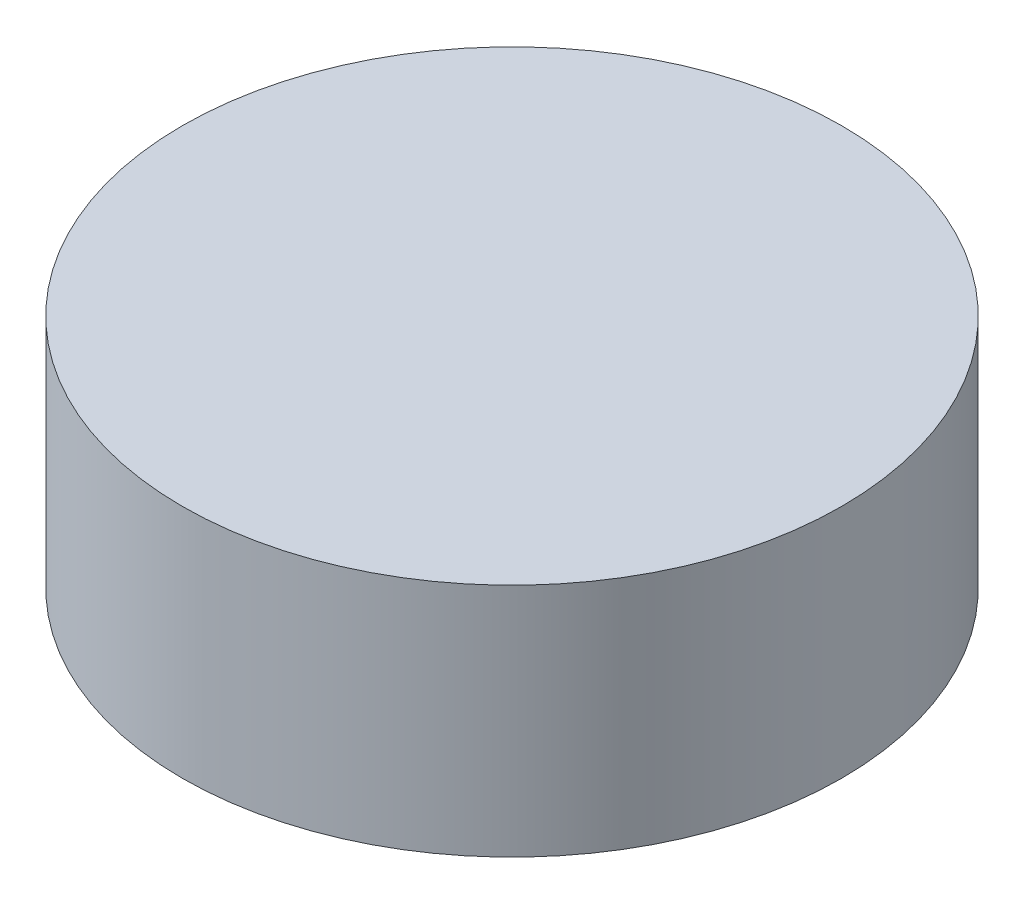
ISO-10303-21;
HEADER;
FILE_DESCRIPTION(('STEP AP214'),'2;1');
FILE_NAME('part.step','',(''),(''),'','','');
FILE_SCHEMA(('AUTOMOTIVE_DESIGN { 1 0 10303 214 1 1 1 1 }'));
ENDSEC;
DATA;
#1=APPLICATION_CONTEXT('core data for automotive mechanical design processes');
#2=APPLICATION_PROTOCOL_DEFINITION('international standard','automotive_design',2000,#1);
#3=PRODUCT_CONTEXT('',#1,'mechanical');
#4=PRODUCT('Part','Part','',(#3));
#5=PRODUCT_RELATED_PRODUCT_CATEGORY('part','',(#4));
#6=PRODUCT_DEFINITION_FORMATION('','',#4);
#7=PRODUCT_DEFINITION_CONTEXT('part definition',#1,'design');
#8=PRODUCT_DEFINITION('design','',#6,#7);
#9=PRODUCT_DEFINITION_SHAPE('','',#8);
#10=(LENGTH_UNIT() NAMED_UNIT(*) SI_UNIT(.MILLI.,.METRE.));
#11=(NAMED_UNIT(*) PLANE_ANGLE_UNIT() SI_UNIT($,.RADIAN.));
#12=(NAMED_UNIT(*) SI_UNIT($,.STERADIAN.) SOLID_ANGLE_UNIT());
#13=UNCERTAINTY_MEASURE_WITH_UNIT(LENGTH_MEASURE(1.E-05),#10,'distance_accuracy_value','');
#14=(GEOMETRIC_REPRESENTATION_CONTEXT(3) GLOBAL_UNCERTAINTY_ASSIGNED_CONTEXT((#13)) GLOBAL_UNIT_ASSIGNED_CONTEXT((#10,
#11,#12)) REPRESENTATION_CONTEXT('',''));
#15=CARTESIAN_POINT('',(0.,0.,0.));
#16=DIRECTION('',(0.,0.,1.));
#17=DIRECTION('',(1.,0.,0.));
#18=AXIS2_PLACEMENT_3D('',#15,#16,#17);
#19=CARTESIAN_POINT('',(0.,5.,0.));
#20=DIRECTION('',(0.,-1.,0.));
#21=DIRECTION('',(0.,0.,-1.));
#22=AXIS2_PLACEMENT_3D('',#19,#20,#21);
#23=CYLINDRICAL_SURFACE('',#22,7.);
#24=CARTESIAN_POINT('',(0.,5.,0.));
#25=DIRECTION('',(0.,1.,0.));
#26=DIRECTION('',(0.,0.,1.));
#27=AXIS2_PLACEMENT_3D('',#24,#25,#26);
#28=CIRCLE('',#27,7.);
#29=CARTESIAN_POINT('',(0.,5.,7.));
#30=VERTEX_POINT('',#29);
#31=EDGE_CURVE('E10',#30,#30,#28,.T.);
#32=ORIENTED_EDGE('',*,*,#31,.F.);
#33=EDGE_LOOP('',(#32));
#34=FACE_BOUND('',#33,.T.);
#35=CARTESIAN_POINT('',(0.,0.,0.));
#36=DIRECTION('',(0.,1.,0.));
#37=DIRECTION('',(0.,0.,1.));
#38=AXIS2_PLACEMENT_3D('',#35,#36,#37);
#39=CIRCLE('',#38,7.);
#40=CARTESIAN_POINT('',(0.,0.,7.));
#41=VERTEX_POINT('',#40);
#42=EDGE_CURVE('E40',#41,#41,#39,.T.);
#43=ORIENTED_EDGE('',*,*,#42,.T.);
#44=EDGE_LOOP('',(#43));
#45=FACE_BOUND('',#44,.T.);
#46=ADVANCED_FACE('F37',(#34,#45),#23,.T.);
#47=CARTESIAN_POINT('',(0.,5.,0.));
#48=DIRECTION('',(0.,1.,0.));
#49=DIRECTION('',(0.,0.,1.));
#50=AXIS2_PLACEMENT_3D('',#47,#48,#49);
#51=PLANE('',#50);
#52=ORIENTED_EDGE('',*,*,#31,.T.);
#53=EDGE_LOOP('',(#52));
#54=FACE_BOUND('',#53,.T.);
#55=ADVANCED_FACE('F52',(#54),#51,.T.);
#56=CARTESIAN_POINT('',(0.,0.,0.));
#57=DIRECTION('',(0.,1.,0.));
#58=DIRECTION('',(0.,0.,1.));
#59=AXIS2_PLACEMENT_3D('',#56,#57,#58);
#60=PLANE('',#59);
#61=ORIENTED_EDGE('',*,*,#42,.F.);
#62=EDGE_LOOP('',(#61));
#63=FACE_BOUND('',#62,.T.);
#64=ADVANCED_FACE('F50',(#63),#60,.F.);
#65=CLOSED_SHELL('',(#46,#55,#64));
#66=MANIFOLD_SOLID_BREP('B2',#65);
#67=ADVANCED_BREP_SHAPE_REPRESENTATION('',(#18,#66),#14);
#68=SHAPE_DEFINITION_REPRESENTATION(#9,#67);
ENDSEC;
END-ISO-10303-21;
